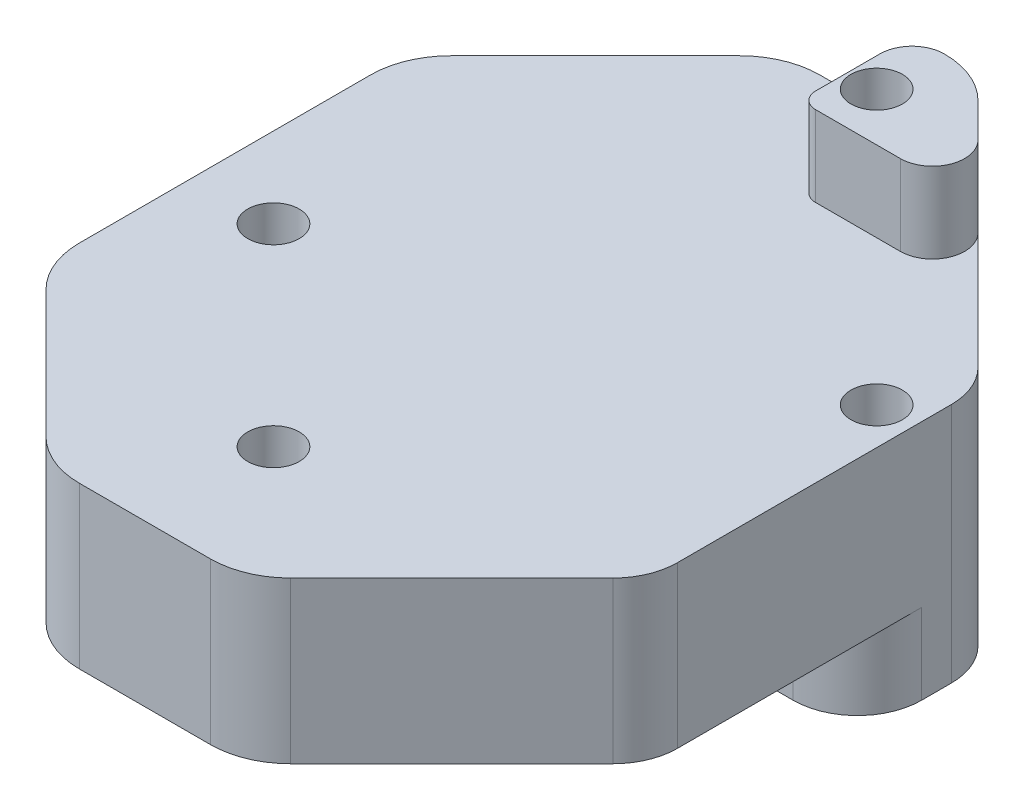
ISO-10303-21;
HEADER;
FILE_DESCRIPTION(('STEP AP214'),'2;1');
FILE_NAME('part.step','',(''),(''),'','','');
FILE_SCHEMA(('AUTOMOTIVE_DESIGN { 1 0 10303 214 1 1 1 1 }'));
ENDSEC;
DATA;
#1=APPLICATION_CONTEXT('core data for automotive mechanical design processes');
#2=APPLICATION_PROTOCOL_DEFINITION('international standard','automotive_design',2000,#1);
#3=PRODUCT_CONTEXT('',#1,'mechanical');
#4=PRODUCT('Part','Part','',(#3));
#5=PRODUCT_RELATED_PRODUCT_CATEGORY('part','',(#4));
#6=PRODUCT_DEFINITION_FORMATION('','',#4);
#7=PRODUCT_DEFINITION_CONTEXT('part definition',#1,'design');
#8=PRODUCT_DEFINITION('design','',#6,#7);
#9=PRODUCT_DEFINITION_SHAPE('','',#8);
#10=(LENGTH_UNIT() NAMED_UNIT(*) SI_UNIT(.MILLI.,.METRE.));
#11=(NAMED_UNIT(*) PLANE_ANGLE_UNIT() SI_UNIT($,.RADIAN.));
#12=(NAMED_UNIT(*) SI_UNIT($,.STERADIAN.) SOLID_ANGLE_UNIT());
#13=UNCERTAINTY_MEASURE_WITH_UNIT(LENGTH_MEASURE(1.E-05),#10,'distance_accuracy_value','');
#14=(GEOMETRIC_REPRESENTATION_CONTEXT(3) GLOBAL_UNCERTAINTY_ASSIGNED_CONTEXT((#13)) GLOBAL_UNIT_ASSIGNED_CONTEXT((#10,
#11,#12)) REPRESENTATION_CONTEXT('',''));
#15=CARTESIAN_POINT('',(0.,0.,0.));
#16=DIRECTION('',(0.,0.,1.));
#17=DIRECTION('',(1.,0.,0.));
#18=AXIS2_PLACEMENT_3D('',#15,#16,#17);
#19=CARTESIAN_POINT('',(0.,10.,0.));
#20=DIRECTION('',(0.,-1.,0.));
#21=DIRECTION('',(0.,0.,-1.));
#22=AXIS2_PLACEMENT_3D('',#19,#20,#21);
#23=PLANE('',#22);
#24=CARTESIAN_POINT('',(0.,10.,0.));
#25=DIRECTION('',(0.,1.,0.));
#26=DIRECTION('',(0.,0.,1.));
#27=AXIS2_PLACEMENT_3D('',#24,#25,#26);
#28=CIRCLE('',#27,1.6);
#29=CARTESIAN_POINT('',(0.,10.,1.6));
#30=VERTEX_POINT('',#29);
#31=EDGE_CURVE('E326',#30,#30,#28,.T.);
#32=ORIENTED_EDGE('',*,*,#31,.F.);
#33=EDGE_LOOP('',(#32));
#34=FACE_BOUND('',#33,.T.);
#35=CARTESIAN_POINT('',(-12.,10.,-12.));
#36=DIRECTION('',(0.,1.,0.));
#37=DIRECTION('',(0.,0.,1.));
#38=AXIS2_PLACEMENT_3D('',#35,#36,#37);
#39=CIRCLE('',#38,1.6);
#40=CARTESIAN_POINT('',(-12.,10.,-10.4));
#41=VERTEX_POINT('',#40);
#42=EDGE_CURVE('E320',#41,#41,#39,.T.);
#43=ORIENTED_EDGE('',*,*,#42,.F.);
#44=EDGE_LOOP('',(#43));
#45=FACE_BOUND('',#44,.T.);
#46=CARTESIAN_POINT('',(16.5,10.,-21.));
#47=DIRECTION('',(0.,1.,0.));
#48=DIRECTION('',(0.,0.,1.));
#49=AXIS2_PLACEMENT_3D('',#46,#47,#48);
#50=CIRCLE('',#49,1.60000000000001);
#51=CARTESIAN_POINT('',(16.5,10.,-19.4));
#52=VERTEX_POINT('',#51);
#53=EDGE_CURVE('E316',#52,#52,#50,.T.);
#54=ORIENTED_EDGE('',*,*,#53,.F.);
#55=EDGE_LOOP('',(#54));
#56=FACE_BOUND('',#55,.T.);
#57=DIRECTION('',(0.707106781186549,0.,-0.707106781186547));
#58=VECTOR('',#57,1.);
#59=CARTESIAN_POINT('',(6.14213562373095,10.,8.));
#60=LINE('',#59,#58);
#61=CARTESIAN_POINT('',(7.60660171779821,10.,6.53553390593274));
#62=VERTEX_POINT('',#61);
#63=CARTESIAN_POINT('',(17.6284271247462,10.,-3.4862915010152));
#64=VERTEX_POINT('',#63);
#65=EDGE_CURVE('E273',#62,#64,#60,.T.);
#66=ORIENTED_EDGE('',*,*,#65,.T.);
#67=CARTESIAN_POINT('',(14.8,10.,-6.3147186257614));
#68=DIRECTION('',(0.,-1.,0.));
#69=DIRECTION('',(0.,0.,-1.));
#70=AXIS2_PLACEMENT_3D('',#67,#68,#69);
#71=CIRCLE('',#70,4.);
#72=CARTESIAN_POINT('',(18.8,10.,-6.3147186257614));
#73=VERTEX_POINT('',#72);
#74=EDGE_CURVE('E448',#64,#73,#71,.F.);
#75=ORIENTED_EDGE('',*,*,#74,.T.);
#76=DIRECTION('',(0.,0.,1.));
#77=VECTOR('',#76,1.);
#78=CARTESIAN_POINT('',(18.8,10.,-25.));
#79=LINE('',#78,#77);
#80=CARTESIAN_POINT('',(18.8,10.,-23.3431457505076));
#81=VERTEX_POINT('',#80);
#82=EDGE_CURVE('E467',#81,#73,#79,.T.);
#83=ORIENTED_EDGE('',*,*,#82,.F.);
#84=CARTESIAN_POINT('',(14.8,10.,-23.3431457505076));
#85=DIRECTION('',(0.,-1.,0.));
#86=DIRECTION('',(0.,0.,-1.));
#87=AXIS2_PLACEMENT_3D('',#84,#85,#86);
#88=CIRCLE('',#87,4.);
#89=CARTESIAN_POINT('',(17.6284271247462,10.,-26.1715728752538));
#90=VERTEX_POINT('',#89);
#91=EDGE_CURVE('E50',#81,#90,#88,.F.);
#92=ORIENTED_EDGE('',*,*,#91,.T.);
#93=DIRECTION('',(-0.707106781186548,0.,-0.707106781186548));
#94=VECTOR('',#93,1.);
#95=CARTESIAN_POINT('',(6.79999999999999,10.,-37.));
#96=LINE('',#95,#94);
#97=CARTESIAN_POINT('',(10.3857864376269,10.,-33.4142135623731));
#98=VERTEX_POINT('',#97);
#99=EDGE_CURVE('E341',#90,#98,#96,.T.);
#100=ORIENTED_EDGE('',*,*,#99,.T.);
#101=CARTESIAN_POINT('',(8.9715728752538,10.,-32.));
#102=DIRECTION('',(0.,-1.,0.));
#103=DIRECTION('',(0.,0.,-1.));
#104=AXIS2_PLACEMENT_3D('',#101,#102,#103);
#105=CIRCLE('',#104,2.);
#106=CARTESIAN_POINT('',(8.9715728752538,10.,-30.));
#107=VERTEX_POINT('',#106);
#108=EDGE_CURVE('E428',#98,#107,#105,.T.);
#109=ORIENTED_EDGE('',*,*,#108,.T.);
#110=DIRECTION('',(1.,0.,0.));
#111=VECTOR('',#110,1.);
#112=CARTESIAN_POINT('',(3.7,10.,-30.));
#113=LINE('',#112,#111);
#114=CARTESIAN_POINT('',(3.7,10.,-30.));
#115=VERTEX_POINT('',#114);
#116=EDGE_CURVE('E264',#115,#107,#113,.T.);
#117=ORIENTED_EDGE('',*,*,#116,.F.);
#118=CARTESIAN_POINT('',(3.7,10.,-31.));
#119=DIRECTION('',(0.,1.,0.));
#120=DIRECTION('',(0.,0.,1.));
#121=AXIS2_PLACEMENT_3D('',#118,#119,#120);
#122=CIRCLE('',#121,1.);
#123=CARTESIAN_POINT('',(2.7,10.,-31.));
#124=VERTEX_POINT('',#123);
#125=EDGE_CURVE('E261',#124,#115,#122,.T.);
#126=ORIENTED_EDGE('',*,*,#125,.F.);
#127=DIRECTION('',(0.,0.,1.));
#128=VECTOR('',#127,1.);
#129=CARTESIAN_POINT('',(2.7,10.,-37.));
#130=LINE('',#129,#128);
#131=CARTESIAN_POINT('',(2.7,10.,-35.));
#132=VERTEX_POINT('',#131);
#133=EDGE_CURVE('E240',#132,#124,#130,.T.);
#134=ORIENTED_EDGE('',*,*,#133,.F.);
#135=CARTESIAN_POINT('',(4.7,10.,-35.));
#136=DIRECTION('',(0.,-1.,0.));
#137=DIRECTION('',(0.,0.,-1.));
#138=AXIS2_PLACEMENT_3D('',#135,#136,#137);
#139=CIRCLE('',#138,2.);
#140=CARTESIAN_POINT('',(4.69999999999999,10.,-37.));
#141=VERTEX_POINT('',#140);
#142=EDGE_CURVE('E425',#132,#141,#139,.T.);
#143=ORIENTED_EDGE('',*,*,#142,.T.);
#144=DIRECTION('',(-1.,0.,0.));
#145=VECTOR('',#144,1.);
#146=CARTESIAN_POINT('',(-17.,10.,-37.));
#147=LINE('',#146,#145);
#148=CARTESIAN_POINT('',(-3.02893218813453,10.,-37.));
#149=VERTEX_POINT('',#148);
#150=EDGE_CURVE('E332',#141,#149,#147,.T.);
#151=ORIENTED_EDGE('',*,*,#150,.T.);
#152=CARTESIAN_POINT('',(-3.02893218813452,10.,-32.));
#153=DIRECTION('',(0.,-1.,0.));
#154=DIRECTION('',(0.,0.,-1.));
#155=AXIS2_PLACEMENT_3D('',#152,#153,#154);
#156=CIRCLE('',#155,5.);
#157=CARTESIAN_POINT('',(-6.56446609406727,10.,-35.5355339059327));
#158=VERTEX_POINT('',#157);
#159=EDGE_CURVE('E353',#149,#158,#156,.F.);
#160=ORIENTED_EDGE('',*,*,#159,.T.);
#161=DIRECTION('',(-0.707106781186546,0.,0.707106781186549));
#162=VECTOR('',#161,1.);
#163=CARTESIAN_POINT('',(-5.10000000000001,10.,-37.));
#164=LINE('',#163,#162);
#165=CARTESIAN_POINT('',(-15.5355339059327,10.,-26.5644660940672));
#166=VERTEX_POINT('',#165);
#167=EDGE_CURVE('E244',#158,#166,#164,.T.);
#168=ORIENTED_EDGE('',*,*,#167,.T.);
#169=CARTESIAN_POINT('',(-12.,10.,-23.0289321881345));
#170=DIRECTION('',(0.,-1.,0.));
#171=DIRECTION('',(0.,0.,-1.));
#172=AXIS2_PLACEMENT_3D('',#169,#170,#171);
#173=CIRCLE('',#172,5.);
#174=CARTESIAN_POINT('',(-17.,10.,-23.0289321881345));
#175=VERTEX_POINT('',#174);
#176=EDGE_CURVE('E355',#166,#175,#173,.F.);
#177=ORIENTED_EDGE('',*,*,#176,.T.);
#178=DIRECTION('',(0.,0.,1.));
#179=VECTOR('',#178,1.);
#180=CARTESIAN_POINT('',(-17.,10.,8.));
#181=LINE('',#180,#179);
#182=CARTESIAN_POINT('',(-17.,10.,-4.92893218813449));
#183=VERTEX_POINT('',#182);
#184=EDGE_CURVE('E334',#175,#183,#181,.T.);
#185=ORIENTED_EDGE('',*,*,#184,.T.);
#186=CARTESIAN_POINT('',(-12.,10.,-4.92893218813449));
#187=DIRECTION('',(0.,-1.,0.));
#188=DIRECTION('',(0.,0.,-1.));
#189=AXIS2_PLACEMENT_3D('',#186,#187,#188);
#190=CIRCLE('',#189,5.);
#191=CARTESIAN_POINT('',(-15.5355339059327,10.,-1.39339828220175));
#192=VERTEX_POINT('',#191);
#193=EDGE_CURVE('E357',#183,#192,#190,.F.);
#194=ORIENTED_EDGE('',*,*,#193,.T.);
#195=DIRECTION('',(0.707106781186549,0.,0.707106781186546));
#196=VECTOR('',#195,1.);
#197=CARTESIAN_POINT('',(-17.,10.,-2.85786437626901));
#198=LINE('',#197,#196);
#199=CARTESIAN_POINT('',(-7.60660171779822,10.,6.53553390593274));
#200=VERTEX_POINT('',#199);
#201=EDGE_CURVE('E270',#192,#200,#198,.T.);
#202=ORIENTED_EDGE('',*,*,#201,.T.);
#203=CARTESIAN_POINT('',(-4.07106781186549,10.,3.));
#204=DIRECTION('',(0.,-1.,0.));
#205=DIRECTION('',(0.,0.,-1.));
#206=AXIS2_PLACEMENT_3D('',#203,#204,#205);
#207=CIRCLE('',#206,5.);
#208=CARTESIAN_POINT('',(-4.07106781186549,10.,8.));
#209=VERTEX_POINT('',#208);
#210=EDGE_CURVE('E359',#200,#209,#207,.F.);
#211=ORIENTED_EDGE('',*,*,#210,.T.);
#212=DIRECTION('',(1.,0.,0.));
#213=VECTOR('',#212,1.);
#214=CARTESIAN_POINT('',(21.8,10.,8.));
#215=LINE('',#214,#213);
#216=CARTESIAN_POINT('',(4.07106781186548,10.,8.));
#217=VERTEX_POINT('',#216);
#218=EDGE_CURVE('E338',#209,#217,#215,.T.);
#219=ORIENTED_EDGE('',*,*,#218,.T.);
#220=CARTESIAN_POINT('',(4.07106781186548,10.,3.));
#221=DIRECTION('',(0.,-1.,0.));
#222=DIRECTION('',(0.,0.,-1.));
#223=AXIS2_PLACEMENT_3D('',#220,#221,#222);
#224=CIRCLE('',#223,5.);
#225=EDGE_CURVE('E361',#217,#62,#224,.F.);
#226=ORIENTED_EDGE('',*,*,#225,.T.);
#227=EDGE_LOOP('',(#66,#75,#83,#92,#100,#109,#117,#126,#134,#143,#151,#160,#168,#177,#185,#194,
#202,#211,#219,#226));
#228=FACE_BOUND('',#227,.T.);
#229=ADVANCED_FACE('F35',(#34,#45,#56,#228),#23,.F.);
#230=CARTESIAN_POINT('',(0.,0.,0.));
#231=DIRECTION('',(0.,-1.,0.));
#232=DIRECTION('',(0.,0.,-1.));
#233=AXIS2_PLACEMENT_3D('',#230,#231,#232);
#234=PLANE('',#233);
#235=DIRECTION('',(0.,0.,-1.));
#236=VECTOR('',#235,1.);
#237=CARTESIAN_POINT('',(18.8,0.,0.));
#238=LINE('',#237,#236);
#239=CARTESIAN_POINT('',(18.8,0.,-6.3147186257614));
#240=VERTEX_POINT('',#239);
#241=CARTESIAN_POINT('',(18.8,0.,-21.5));
#242=VERTEX_POINT('',#241);
#243=EDGE_CURVE('E471',#240,#242,#238,.T.);
#244=ORIENTED_EDGE('',*,*,#243,.F.);
#245=CARTESIAN_POINT('',(14.8,0.,-6.3147186257614));
#246=DIRECTION('',(0.,-1.,0.));
#247=DIRECTION('',(0.,0.,-1.));
#248=AXIS2_PLACEMENT_3D('',#245,#246,#247);
#249=CIRCLE('',#248,4.);
#250=CARTESIAN_POINT('',(17.6284271247462,0.,-3.4862915010152));
#251=VERTEX_POINT('',#250);
#252=EDGE_CURVE('E58',#240,#251,#249,.T.);
#253=ORIENTED_EDGE('',*,*,#252,.T.);
#254=DIRECTION('',(-0.707106781186549,0.,0.707106781186547));
#255=VECTOR('',#254,1.);
#256=CARTESIAN_POINT('',(7.07106781186547,0.,7.07106781186549));
#257=LINE('',#256,#255);
#258=CARTESIAN_POINT('',(7.60660171779822,0.,6.53553390593274));
#259=VERTEX_POINT('',#258);
#260=EDGE_CURVE('E276',#251,#259,#257,.T.);
#261=ORIENTED_EDGE('',*,*,#260,.T.);
#262=CARTESIAN_POINT('',(4.07106781186548,0.,3.));
#263=DIRECTION('',(0.,-1.,0.));
#264=DIRECTION('',(0.,0.,-1.));
#265=AXIS2_PLACEMENT_3D('',#262,#263,#264);
#266=CIRCLE('',#265,5.);
#267=CARTESIAN_POINT('',(4.07106781186548,0.,8.));
#268=VERTEX_POINT('',#267);
#269=EDGE_CURVE('E371',#259,#268,#266,.T.);
#270=ORIENTED_EDGE('',*,*,#269,.T.);
#271=DIRECTION('',(1.,0.,0.));
#272=VECTOR('',#271,1.);
#273=CARTESIAN_POINT('',(21.8,0.,8.));
#274=LINE('',#273,#272);
#275=CARTESIAN_POINT('',(-4.07106781186549,0.,8.));
#276=VERTEX_POINT('',#275);
#277=EDGE_CURVE('E335',#276,#268,#274,.T.);
#278=ORIENTED_EDGE('',*,*,#277,.F.);
#279=CARTESIAN_POINT('',(-4.07106781186549,0.,3.));
#280=DIRECTION('',(0.,-1.,0.));
#281=DIRECTION('',(0.,0.,-1.));
#282=AXIS2_PLACEMENT_3D('',#279,#280,#281);
#283=CIRCLE('',#282,5.);
#284=CARTESIAN_POINT('',(-7.60660171779822,0.,6.53553390593274));
#285=VERTEX_POINT('',#284);
#286=EDGE_CURVE('E369',#276,#285,#283,.T.);
#287=ORIENTED_EDGE('',*,*,#286,.T.);
#288=DIRECTION('',(-0.707106781186549,0.,-0.707106781186546));
#289=VECTOR('',#288,1.);
#290=CARTESIAN_POINT('',(-7.07106781186547,0.,7.07106781186549));
#291=LINE('',#290,#289);
#292=CARTESIAN_POINT('',(-15.5355339059327,0.,-1.39339828220175));
#293=VERTEX_POINT('',#292);
#294=EDGE_CURVE('E278',#285,#293,#291,.T.);
#295=ORIENTED_EDGE('',*,*,#294,.T.);
#296=CARTESIAN_POINT('',(-12.,0.,-4.92893218813449));
#297=DIRECTION('',(0.,-1.,0.));
#298=DIRECTION('',(0.,0.,-1.));
#299=AXIS2_PLACEMENT_3D('',#296,#297,#298);
#300=CIRCLE('',#299,5.);
#301=CARTESIAN_POINT('',(-17.,0.,-4.92893218813449));
#302=VERTEX_POINT('',#301);
#303=EDGE_CURVE('E367',#293,#302,#300,.T.);
#304=ORIENTED_EDGE('',*,*,#303,.T.);
#305=DIRECTION('',(0.,0.,1.));
#306=VECTOR('',#305,1.);
#307=CARTESIAN_POINT('',(-17.,0.,8.));
#308=LINE('',#307,#306);
#309=CARTESIAN_POINT('',(-17.,0.,-23.0289321881345));
#310=VERTEX_POINT('',#309);
#311=EDGE_CURVE('E346',#310,#302,#308,.T.);
#312=ORIENTED_EDGE('',*,*,#311,.F.);
#313=CARTESIAN_POINT('',(-12.,0.,-23.0289321881345));
#314=DIRECTION('',(0.,-1.,0.));
#315=DIRECTION('',(0.,0.,-1.));
#316=AXIS2_PLACEMENT_3D('',#313,#314,#315);
#317=CIRCLE('',#316,5.);
#318=CARTESIAN_POINT('',(-15.5355339059327,0.,-26.5644660940672));
#319=VERTEX_POINT('',#318);
#320=EDGE_CURVE('E365',#310,#319,#317,.T.);
#321=ORIENTED_EDGE('',*,*,#320,.T.);
#322=DIRECTION('',(0.707106781186546,0.,-0.707106781186549));
#323=VECTOR('',#322,1.);
#324=CARTESIAN_POINT('',(-21.05,0.,-21.0499999999999));
#325=LINE('',#324,#323);
#326=CARTESIAN_POINT('',(-6.56446609406727,0.,-35.5355339059327));
#327=VERTEX_POINT('',#326);
#328=EDGE_CURVE('E281',#319,#327,#325,.T.);
#329=ORIENTED_EDGE('',*,*,#328,.T.);
#330=CARTESIAN_POINT('',(-3.02893218813452,0.,-32.));
#331=DIRECTION('',(0.,-1.,0.));
#332=DIRECTION('',(0.,0.,-1.));
#333=AXIS2_PLACEMENT_3D('',#330,#331,#332);
#334=CIRCLE('',#333,5.);
#335=CARTESIAN_POINT('',(-3.02893218813453,0.,-37.));
#336=VERTEX_POINT('',#335);
#337=EDGE_CURVE('E363',#327,#336,#334,.T.);
#338=ORIENTED_EDGE('',*,*,#337,.T.);
#339=DIRECTION('',(-1.,0.,0.));
#340=VECTOR('',#339,1.);
#341=CARTESIAN_POINT('',(-17.,0.,-37.));
#342=LINE('',#341,#340);
#343=CARTESIAN_POINT('',(2.,0.,-37.));
#344=VERTEX_POINT('',#343);
#345=EDGE_CURVE('E329',#344,#336,#342,.T.);
#346=ORIENTED_EDGE('',*,*,#345,.F.);
#347=CARTESIAN_POINT('',(2.,0.,-35.));
#348=DIRECTION('',(0.,-1.,0.));
#349=DIRECTION('',(0.,0.,-1.));
#350=AXIS2_PLACEMENT_3D('',#347,#348,#349);
#351=CIRCLE('',#350,2.);
#352=CARTESIAN_POINT('',(0.,0.,-35.));
#353=VERTEX_POINT('',#352);
#354=EDGE_CURVE('E411',#344,#353,#351,.F.);
#355=ORIENTED_EDGE('',*,*,#354,.T.);
#356=DIRECTION('',(0.,0.,-1.));
#357=VECTOR('',#356,1.);
#358=CARTESIAN_POINT('',(0.,0.,-19.5));
#359=LINE('',#358,#357);
#360=CARTESIAN_POINT('',(0.,0.,-19.5));
#361=VERTEX_POINT('',#360);
#362=EDGE_CURVE('E294',#361,#353,#359,.T.);
#363=ORIENTED_EDGE('',*,*,#362,.F.);
#364=CARTESIAN_POINT('',(2.,0.,-19.5));
#365=DIRECTION('',(0.,-1.,0.));
#366=DIRECTION('',(0.,0.,-1.));
#367=AXIS2_PLACEMENT_3D('',#364,#365,#366);
#368=CIRCLE('',#367,2.);
#369=CARTESIAN_POINT('',(2.,0.,-17.5));
#370=VERTEX_POINT('',#369);
#371=EDGE_CURVE('E306',#370,#361,#368,.T.);
#372=ORIENTED_EDGE('',*,*,#371,.F.);
#373=DIRECTION('',(-1.,0.,0.));
#374=VECTOR('',#373,1.);
#375=CARTESIAN_POINT('',(21.8,0.,-17.5));
#376=LINE('',#375,#374);
#377=CARTESIAN_POINT('',(14.8,0.,-17.5));
#378=VERTEX_POINT('',#377);
#379=EDGE_CURVE('E290',#378,#370,#376,.T.);
#380=ORIENTED_EDGE('',*,*,#379,.F.);
#381=CARTESIAN_POINT('',(14.8,0.,-21.5));
#382=DIRECTION('',(0.,-1.,0.));
#383=DIRECTION('',(0.,0.,-1.));
#384=AXIS2_PLACEMENT_3D('',#381,#382,#383);
#385=CIRCLE('',#384,4.);
#386=EDGE_CURVE('E12',#378,#242,#385,.F.);
#387=ORIENTED_EDGE('',*,*,#386,.T.);
#388=EDGE_LOOP('',(#244,#253,#261,#270,#278,#287,#295,#304,#312,#321,#329,#338,#346,#355,#363,
#372,#380,#387));
#389=FACE_BOUND('',#388,.T.);
#390=CARTESIAN_POINT('',(0.,0.,0.));
#391=DIRECTION('',(0.,1.,0.));
#392=DIRECTION('',(0.,0.,1.));
#393=AXIS2_PLACEMENT_3D('',#390,#391,#392);
#394=CIRCLE('',#393,1.6);
#395=CARTESIAN_POINT('',(0.,0.,1.6));
#396=VERTEX_POINT('',#395);
#397=EDGE_CURVE('E323',#396,#396,#394,.T.);
#398=ORIENTED_EDGE('',*,*,#397,.T.);
#399=EDGE_LOOP('',(#398));
#400=FACE_BOUND('',#399,.T.);
#401=CARTESIAN_POINT('',(-12.,0.,-12.));
#402=DIRECTION('',(0.,1.,0.));
#403=DIRECTION('',(0.,0.,1.));
#404=AXIS2_PLACEMENT_3D('',#401,#402,#403);
#405=CIRCLE('',#404,1.6);
#406=CARTESIAN_POINT('',(-12.,0.,-10.4));
#407=VERTEX_POINT('',#406);
#408=EDGE_CURVE('E319',#407,#407,#405,.T.);
#409=ORIENTED_EDGE('',*,*,#408,.T.);
#410=EDGE_LOOP('',(#409));
#411=FACE_BOUND('',#410,.T.);
#412=ADVANCED_FACE('F501',(#389,#400,#411),#234,.T.);
#413=CARTESIAN_POINT('',(-17.,10.,-37.));
#414=DIRECTION('',(0.,0.,1.));
#415=DIRECTION('',(1.,0.,0.));
#416=AXIS2_PLACEMENT_3D('',#413,#414,#415);
#417=PLANE('',#416);
#418=ORIENTED_EDGE('',*,*,#150,.F.);
#419=DIRECTION('',(0.,-1.,0.));
#420=VECTOR('',#419,1.);
#421=CARTESIAN_POINT('',(4.7,10.,-37.));
#422=LINE('',#421,#420);
#423=CARTESIAN_POINT('',(4.69999999999999,15.,-37.));
#424=VERTEX_POINT('',#423);
#425=EDGE_CURVE('E415',#141,#424,#422,.F.);
#426=ORIENTED_EDGE('',*,*,#425,.T.);
#427=DIRECTION('',(-1.,0.,0.));
#428=VECTOR('',#427,1.);
#429=CARTESIAN_POINT('',(4.72893218813451,15.,-37.));
#430=LINE('',#429,#428);
#431=CARTESIAN_POINT('',(4.72893218813451,15.,-37.));
#432=VERTEX_POINT('',#431);
#433=EDGE_CURVE('E234',#432,#424,#430,.T.);
#434=ORIENTED_EDGE('',*,*,#433,.F.);
#435=DIRECTION('',(0.,-1.,0.));
#436=VECTOR('',#435,1.);
#437=CARTESIAN_POINT('',(4.72893218813451,10.,-37.));
#438=LINE('',#437,#436);
#439=CARTESIAN_POINT('',(4.72893218813451,-5.,-37.));
#440=VERTEX_POINT('',#439);
#441=EDGE_CURVE('E393',#432,#440,#438,.T.);
#442=ORIENTED_EDGE('',*,*,#441,.T.);
#443=DIRECTION('',(1.,0.,0.));
#444=VECTOR('',#443,1.);
#445=CARTESIAN_POINT('',(0.,-5.,-37.));
#446=LINE('',#445,#444);
#447=CARTESIAN_POINT('',(2.,-5.,-37.));
#448=VERTEX_POINT('',#447);
#449=EDGE_CURVE('E299',#448,#440,#446,.T.);
#450=ORIENTED_EDGE('',*,*,#449,.F.);
#451=DIRECTION('',(0.,1.,0.));
#452=VECTOR('',#451,1.);
#453=CARTESIAN_POINT('',(2.,10.,-37.));
#454=LINE('',#453,#452);
#455=EDGE_CURVE('E404',#448,#344,#454,.T.);
#456=ORIENTED_EDGE('',*,*,#455,.T.);
#457=ORIENTED_EDGE('',*,*,#345,.T.);
#458=DIRECTION('',(0.,1.,0.));
#459=VECTOR('',#458,1.);
#460=CARTESIAN_POINT('',(-3.02893218813452,10.,-37.));
#461=LINE('',#460,#459);
#462=EDGE_CURVE('E396',#336,#149,#461,.T.);
#463=ORIENTED_EDGE('',*,*,#462,.T.);
#464=EDGE_LOOP('',(#418,#426,#434,#442,#450,#456,#457,#463));
#465=FACE_BOUND('',#464,.T.);
#466=ADVANCED_FACE('F494',(#465),#417,.F.);
#467=CARTESIAN_POINT('',(-17.,10.,8.));
#468=DIRECTION('',(1.,0.,0.));
#469=DIRECTION('',(0.,0.,-1.));
#470=AXIS2_PLACEMENT_3D('',#467,#468,#469);
#471=PLANE('',#470);
#472=ORIENTED_EDGE('',*,*,#311,.T.);
#473=DIRECTION('',(0.,1.,0.));
#474=VECTOR('',#473,1.);
#475=CARTESIAN_POINT('',(-17.,10.,-4.92893218813449));
#476=LINE('',#475,#474);
#477=EDGE_CURVE('E385',#302,#183,#476,.T.);
#478=ORIENTED_EDGE('',*,*,#477,.T.);
#479=ORIENTED_EDGE('',*,*,#184,.F.);
#480=DIRECTION('',(0.,1.,0.));
#481=VECTOR('',#480,1.);
#482=CARTESIAN_POINT('',(-17.,0.,-23.0289321881345));
#483=LINE('',#482,#481);
#484=EDGE_CURVE('E383',#175,#310,#483,.F.);
#485=ORIENTED_EDGE('',*,*,#484,.T.);
#486=EDGE_LOOP('',(#472,#478,#479,#485));
#487=FACE_BOUND('',#486,.T.);
#488=ADVANCED_FACE('F552',(#487),#471,.F.);
#489=CARTESIAN_POINT('',(21.8,10.,8.));
#490=DIRECTION('',(0.,0.,-1.));
#491=DIRECTION('',(-1.,0.,0.));
#492=AXIS2_PLACEMENT_3D('',#489,#490,#491);
#493=PLANE('',#492);
#494=ORIENTED_EDGE('',*,*,#277,.T.);
#495=DIRECTION('',(0.,1.,0.));
#496=VECTOR('',#495,1.);
#497=CARTESIAN_POINT('',(4.07106781186548,10.,8.));
#498=LINE('',#497,#496);
#499=EDGE_CURVE('E375',#268,#217,#498,.T.);
#500=ORIENTED_EDGE('',*,*,#499,.T.);
#501=ORIENTED_EDGE('',*,*,#218,.F.);
#502=DIRECTION('',(0.,1.,0.));
#503=VECTOR('',#502,1.);
#504=CARTESIAN_POINT('',(-4.07106781186548,0.,8.));
#505=LINE('',#504,#503);
#506=EDGE_CURVE('E373',#209,#276,#505,.F.);
#507=ORIENTED_EDGE('',*,*,#506,.T.);
#508=EDGE_LOOP('',(#494,#500,#501,#507));
#509=FACE_BOUND('',#508,.T.);
#510=ADVANCED_FACE('F534',(#509),#493,.F.);
#511=CARTESIAN_POINT('',(6.79999999999999,10.,-37.));
#512=DIRECTION('',(-0.707106781186548,0.,0.707106781186548));
#513=DIRECTION('',(0.707106781186548,0.,0.707106781186548));
#514=AXIS2_PLACEMENT_3D('',#511,#512,#513);
#515=PLANE('',#514);
#516=ORIENTED_EDGE('',*,*,#99,.F.);
#517=DIRECTION('',(0.,1.,0.));
#518=VECTOR('',#517,1.);
#519=CARTESIAN_POINT('',(17.6284271247462,10.,-26.1715728752538));
#520=LINE('',#519,#518);
#521=CARTESIAN_POINT('',(17.6284271247462,-5.,-26.1715728752538));
#522=VERTEX_POINT('',#521);
#523=EDGE_CURVE('E43',#90,#522,#520,.F.);
#524=ORIENTED_EDGE('',*,*,#523,.T.);
#525=DIRECTION('',(0.707106781186548,0.,0.707106781186548));
#526=VECTOR('',#525,1.);
#527=CARTESIAN_POINT('',(6.79999999999999,-5.,-37.));
#528=LINE('',#527,#526);
#529=CARTESIAN_POINT('',(8.26446609406725,-5.,-35.5355339059327));
#530=VERTEX_POINT('',#529);
#531=EDGE_CURVE('E301',#530,#522,#528,.T.);
#532=ORIENTED_EDGE('',*,*,#531,.F.);
#533=DIRECTION('',(0.,-1.,0.));
#534=VECTOR('',#533,1.);
#535=CARTESIAN_POINT('',(8.26446609406725,10.,-35.5355339059327));
#536=LINE('',#535,#534);
#537=CARTESIAN_POINT('',(8.26446609406725,15.,-35.5355339059327));
#538=VERTEX_POINT('',#537);
#539=EDGE_CURVE('E399',#530,#538,#536,.F.);
#540=ORIENTED_EDGE('',*,*,#539,.T.);
#541=DIRECTION('',(-0.707106781186548,0.,-0.707106781186547));
#542=VECTOR('',#541,1.);
#543=CARTESIAN_POINT('',(13.8,15.,-30.));
#544=LINE('',#543,#542);
#545=CARTESIAN_POINT('',(10.3857864376269,15.,-33.4142135623731));
#546=VERTEX_POINT('',#545);
#547=EDGE_CURVE('E252',#546,#538,#544,.T.);
#548=ORIENTED_EDGE('',*,*,#547,.F.);
#549=DIRECTION('',(0.,-1.,0.));
#550=VECTOR('',#549,1.);
#551=CARTESIAN_POINT('',(10.3857864376269,10.,-33.4142135623731));
#552=LINE('',#551,#550);
#553=EDGE_CURVE('E420',#546,#98,#552,.T.);
#554=ORIENTED_EDGE('',*,*,#553,.T.);
#555=EDGE_LOOP('',(#516,#524,#532,#540,#548,#554));
#556=FACE_BOUND('',#555,.T.);
#557=ADVANCED_FACE('F453',(#556),#515,.F.);
#558=CARTESIAN_POINT('',(0.,10.,0.));
#559=DIRECTION('',(0.,-1.,0.));
#560=DIRECTION('',(0.,0.,-1.));
#561=AXIS2_PLACEMENT_3D('',#558,#559,#560);
#562=CYLINDRICAL_SURFACE('',#561,1.6);
#563=ORIENTED_EDGE('',*,*,#31,.T.);
#564=EDGE_LOOP('',(#563));
#565=FACE_BOUND('',#564,.T.);
#566=ORIENTED_EDGE('',*,*,#397,.F.);
#567=EDGE_LOOP('',(#566));
#568=FACE_BOUND('',#567,.T.);
#569=ADVANCED_FACE('F587',(#565,#568),#562,.F.);
#570=CARTESIAN_POINT('',(-12.,10.,-12.));
#571=DIRECTION('',(0.,-1.,0.));
#572=DIRECTION('',(0.,0.,-1.));
#573=AXIS2_PLACEMENT_3D('',#570,#571,#572);
#574=CYLINDRICAL_SURFACE('',#573,1.6);
#575=ORIENTED_EDGE('',*,*,#42,.T.);
#576=EDGE_LOOP('',(#575));
#577=FACE_BOUND('',#576,.T.);
#578=ORIENTED_EDGE('',*,*,#408,.F.);
#579=EDGE_LOOP('',(#578));
#580=FACE_BOUND('',#579,.T.);
#581=ADVANCED_FACE('F649',(#577,#580),#574,.F.);
#582=CARTESIAN_POINT('',(4.5,10.,-33.));
#583=DIRECTION('',(0.,-1.,0.));
#584=DIRECTION('',(0.,0.,-1.));
#585=AXIS2_PLACEMENT_3D('',#582,#583,#584);
#586=CYLINDRICAL_SURFACE('',#585,1.60000000000001);
#587=CARTESIAN_POINT('',(4.5,-5.,-33.));
#588=DIRECTION('',(0.,-1.,0.));
#589=DIRECTION('',(0.,0.,-1.));
#590=AXIS2_PLACEMENT_3D('',#587,#588,#589);
#591=CIRCLE('',#590,1.60000000000001);
#592=CARTESIAN_POINT('',(4.5,-5.,-34.6));
#593=VERTEX_POINT('',#592);
#594=EDGE_CURVE('E287',#593,#593,#591,.T.);
#595=ORIENTED_EDGE('',*,*,#594,.T.);
#596=EDGE_LOOP('',(#595));
#597=FACE_BOUND('',#596,.T.);
#598=CARTESIAN_POINT('',(4.5,15.,-33.));
#599=DIRECTION('',(0.,1.,0.));
#600=DIRECTION('',(0.,0.,1.));
#601=AXIS2_PLACEMENT_3D('',#598,#599,#600);
#602=CIRCLE('',#601,1.60000000000001);
#603=CARTESIAN_POINT('',(4.5,15.,-31.4));
#604=VERTEX_POINT('',#603);
#605=EDGE_CURVE('E262',#604,#604,#602,.T.);
#606=ORIENTED_EDGE('',*,*,#605,.T.);
#607=EDGE_LOOP('',(#606));
#608=FACE_BOUND('',#607,.T.);
#609=ADVANCED_FACE('F643',(#597,#608),#586,.F.);
#610=CARTESIAN_POINT('',(16.5,10.,-21.));
#611=DIRECTION('',(0.,-1.,0.));
#612=DIRECTION('',(0.,0.,-1.));
#613=AXIS2_PLACEMENT_3D('',#610,#611,#612);
#614=CYLINDRICAL_SURFACE('',#613,1.60000000000001);
#615=ORIENTED_EDGE('',*,*,#53,.T.);
#616=EDGE_LOOP('',(#615));
#617=FACE_BOUND('',#616,.T.);
#618=CARTESIAN_POINT('',(16.5,-5.,-21.));
#619=DIRECTION('',(0.,-1.,0.));
#620=DIRECTION('',(0.,0.,-1.));
#621=AXIS2_PLACEMENT_3D('',#618,#619,#620);
#622=CIRCLE('',#621,1.60000000000001);
#623=CARTESIAN_POINT('',(16.5,-5.,-22.6));
#624=VERTEX_POINT('',#623);
#625=EDGE_CURVE('E284',#624,#624,#622,.T.);
#626=ORIENTED_EDGE('',*,*,#625,.T.);
#627=EDGE_LOOP('',(#626));
#628=FACE_BOUND('',#627,.T.);
#629=ADVANCED_FACE('F648',(#617,#628),#614,.F.);
#630=CARTESIAN_POINT('',(2.,-5.,-19.5));
#631=DIRECTION('',(0.,-1.,0.));
#632=DIRECTION('',(0.,0.,-1.));
#633=AXIS2_PLACEMENT_3D('',#630,#631,#632);
#634=PLANE('',#633);
#635=DIRECTION('',(0.,0.,-1.));
#636=VECTOR('',#635,1.);
#637=CARTESIAN_POINT('',(18.8,-5.,-19.5));
#638=LINE('',#637,#636);
#639=CARTESIAN_POINT('',(18.8,-5.,-21.5));
#640=VERTEX_POINT('',#639);
#641=CARTESIAN_POINT('',(18.8,-5.,-23.3431457505076));
#642=VERTEX_POINT('',#641);
#643=EDGE_CURVE('E469',#640,#642,#638,.T.);
#644=ORIENTED_EDGE('',*,*,#643,.F.);
#645=CARTESIAN_POINT('',(14.8,-5.,-21.5));
#646=DIRECTION('',(0.,-1.,0.));
#647=DIRECTION('',(0.,0.,-1.));
#648=AXIS2_PLACEMENT_3D('',#645,#646,#647);
#649=CIRCLE('',#648,4.);
#650=CARTESIAN_POINT('',(14.8,-5.,-17.5));
#651=VERTEX_POINT('',#650);
#652=EDGE_CURVE('E442',#640,#651,#649,.T.);
#653=ORIENTED_EDGE('',*,*,#652,.T.);
#654=DIRECTION('',(-1.,0.,0.));
#655=VECTOR('',#654,1.);
#656=CARTESIAN_POINT('',(21.8,-5.,-17.5));
#657=LINE('',#656,#655);
#658=CARTESIAN_POINT('',(2.,-5.,-17.5));
#659=VERTEX_POINT('',#658);
#660=EDGE_CURVE('E291',#651,#659,#657,.T.);
#661=ORIENTED_EDGE('',*,*,#660,.T.);
#662=CARTESIAN_POINT('',(2.,-5.,-19.5));
#663=DIRECTION('',(0.,-1.,0.));
#664=DIRECTION('',(0.,0.,-1.));
#665=AXIS2_PLACEMENT_3D('',#662,#663,#664);
#666=CIRCLE('',#665,2.);
#667=CARTESIAN_POINT('',(0.,-5.,-19.5));
#668=VERTEX_POINT('',#667);
#669=EDGE_CURVE('E293',#659,#668,#666,.T.);
#670=ORIENTED_EDGE('',*,*,#669,.T.);
#671=DIRECTION('',(0.,0.,-1.));
#672=VECTOR('',#671,1.);
#673=CARTESIAN_POINT('',(0.,-5.,-19.5));
#674=LINE('',#673,#672);
#675=CARTESIAN_POINT('',(0.,-5.,-35.));
#676=VERTEX_POINT('',#675);
#677=EDGE_CURVE('E296',#668,#676,#674,.T.);
#678=ORIENTED_EDGE('',*,*,#677,.T.);
#679=CARTESIAN_POINT('',(2.,-5.,-35.));
#680=DIRECTION('',(0.,-1.,0.));
#681=DIRECTION('',(0.,0.,-1.));
#682=AXIS2_PLACEMENT_3D('',#679,#680,#681);
#683=CIRCLE('',#682,2.);
#684=EDGE_CURVE('E409',#676,#448,#683,.T.);
#685=ORIENTED_EDGE('',*,*,#684,.T.);
#686=ORIENTED_EDGE('',*,*,#449,.T.);
#687=CARTESIAN_POINT('',(4.72893218813451,-5.,-32.));
#688=DIRECTION('',(0.,-1.,0.));
#689=DIRECTION('',(0.,0.,-1.));
#690=AXIS2_PLACEMENT_3D('',#687,#688,#689);
#691=CIRCLE('',#690,5.);
#692=EDGE_CURVE('E402',#440,#530,#691,.T.);
#693=ORIENTED_EDGE('',*,*,#692,.T.);
#694=ORIENTED_EDGE('',*,*,#531,.T.);
#695=CARTESIAN_POINT('',(14.8,-5.,-23.3431457505076));
#696=DIRECTION('',(0.,-1.,0.));
#697=DIRECTION('',(0.,0.,-1.));
#698=AXIS2_PLACEMENT_3D('',#695,#696,#697);
#699=CIRCLE('',#698,4.);
#700=EDGE_CURVE('E440',#522,#642,#699,.T.);
#701=ORIENTED_EDGE('',*,*,#700,.T.);
#702=EDGE_LOOP('',(#644,#653,#661,#670,#678,#685,#686,#693,#694,#701));
#703=FACE_BOUND('',#702,.T.);
#704=ORIENTED_EDGE('',*,*,#594,.F.);
#705=EDGE_LOOP('',(#704));
#706=FACE_BOUND('',#705,.T.);
#707=ORIENTED_EDGE('',*,*,#625,.F.);
#708=EDGE_LOOP('',(#707));
#709=FACE_BOUND('',#708,.T.);
#710=ADVANCED_FACE('F459',(#703,#706,#709),#634,.T.);
#711=CARTESIAN_POINT('',(21.8,-5.,-17.5));
#712=DIRECTION('',(0.,0.,-1.));
#713=DIRECTION('',(-1.,0.,0.));
#714=AXIS2_PLACEMENT_3D('',#711,#712,#713);
#715=PLANE('',#714);
#716=ORIENTED_EDGE('',*,*,#660,.F.);
#717=DIRECTION('',(0.,1.,0.));
#718=VECTOR('',#717,1.);
#719=CARTESIAN_POINT('',(14.8,-5.,-17.5));
#720=LINE('',#719,#718);
#721=EDGE_CURVE('E430',#651,#378,#720,.T.);
#722=ORIENTED_EDGE('',*,*,#721,.T.);
#723=ORIENTED_EDGE('',*,*,#379,.T.);
#724=DIRECTION('',(0.,1.,0.));
#725=VECTOR('',#724,1.);
#726=CARTESIAN_POINT('',(2.,-5.,-17.5));
#727=LINE('',#726,#725);
#728=EDGE_CURVE('E313',#659,#370,#727,.T.);
#729=ORIENTED_EDGE('',*,*,#728,.F.);
#730=EDGE_LOOP('',(#716,#722,#723,#729));
#731=FACE_BOUND('',#730,.T.);
#732=ADVANCED_FACE('F516',(#731),#715,.F.);
#733=CARTESIAN_POINT('',(2.,-5.,-19.5));
#734=DIRECTION('',(0.,1.,0.));
#735=DIRECTION('',(0.,0.,1.));
#736=AXIS2_PLACEMENT_3D('',#733,#734,#735);
#737=CYLINDRICAL_SURFACE('',#736,2.);
#738=ORIENTED_EDGE('',*,*,#371,.T.);
#739=DIRECTION('',(0.,1.,0.));
#740=VECTOR('',#739,1.);
#741=CARTESIAN_POINT('',(0.,-5.,-19.5));
#742=LINE('',#741,#740);
#743=EDGE_CURVE('E304',#668,#361,#742,.T.);
#744=ORIENTED_EDGE('',*,*,#743,.F.);
#745=ORIENTED_EDGE('',*,*,#669,.F.);
#746=ORIENTED_EDGE('',*,*,#728,.T.);
#747=EDGE_LOOP('',(#738,#744,#745,#746));
#748=FACE_BOUND('',#747,.T.);
#749=ADVANCED_FACE('F510',(#748),#737,.T.);
#750=CARTESIAN_POINT('',(0.,-5.,-19.5));
#751=DIRECTION('',(1.,0.,0.));
#752=DIRECTION('',(0.,0.,-1.));
#753=AXIS2_PLACEMENT_3D('',#750,#751,#752);
#754=PLANE('',#753);
#755=ORIENTED_EDGE('',*,*,#362,.T.);
#756=DIRECTION('',(0.,1.,0.));
#757=VECTOR('',#756,1.);
#758=CARTESIAN_POINT('',(0.,-5.,-35.));
#759=LINE('',#758,#757);
#760=EDGE_CURVE('E407',#353,#676,#759,.F.);
#761=ORIENTED_EDGE('',*,*,#760,.T.);
#762=ORIENTED_EDGE('',*,*,#677,.F.);
#763=ORIENTED_EDGE('',*,*,#743,.T.);
#764=EDGE_LOOP('',(#755,#761,#762,#763));
#765=FACE_BOUND('',#764,.T.);
#766=ADVANCED_FACE('F505',(#765),#754,.F.);
#767=CARTESIAN_POINT('',(6.14213562373095,-5.,8.));
#768=DIRECTION('',(0.707106781186546,0.,0.707106781186548));
#769=DIRECTION('',(0.707106781186549,0.,-0.707106781186547));
#770=AXIS2_PLACEMENT_3D('',#767,#768,#769);
#771=PLANE('',#770);
#772=ORIENTED_EDGE('',*,*,#260,.F.);
#773=DIRECTION('',(0.,1.,0.));
#774=VECTOR('',#773,1.);
#775=CARTESIAN_POINT('',(17.6284271247462,10.,-3.4862915010152));
#776=LINE('',#775,#774);
#777=EDGE_CURVE('E444',#251,#64,#776,.T.);
#778=ORIENTED_EDGE('',*,*,#777,.T.);
#779=ORIENTED_EDGE('',*,*,#65,.F.);
#780=DIRECTION('',(0.,1.,0.));
#781=VECTOR('',#780,1.);
#782=CARTESIAN_POINT('',(7.60660171779821,0.,6.53553390593274));
#783=LINE('',#782,#781);
#784=EDGE_CURVE('E343',#62,#259,#783,.F.);
#785=ORIENTED_EDGE('',*,*,#784,.T.);
#786=EDGE_LOOP('',(#772,#778,#779,#785));
#787=FACE_BOUND('',#786,.T.);
#788=ADVANCED_FACE('F526',(#787),#771,.T.);
#789=CARTESIAN_POINT('',(-17.,-5.,-2.85786437626901));
#790=DIRECTION('',(-0.707106781186546,0.,0.707106781186549));
#791=DIRECTION('',(0.707106781186549,0.,0.707106781186546));
#792=AXIS2_PLACEMENT_3D('',#789,#790,#791);
#793=PLANE('',#792);
#794=ORIENTED_EDGE('',*,*,#294,.F.);
#795=DIRECTION('',(0.,1.,0.));
#796=VECTOR('',#795,1.);
#797=CARTESIAN_POINT('',(-7.60660171779822,10.,6.53553390593274));
#798=LINE('',#797,#796);
#799=EDGE_CURVE('E380',#285,#200,#798,.T.);
#800=ORIENTED_EDGE('',*,*,#799,.T.);
#801=ORIENTED_EDGE('',*,*,#201,.F.);
#802=DIRECTION('',(0.,1.,0.));
#803=VECTOR('',#802,1.);
#804=CARTESIAN_POINT('',(-15.5355339059327,0.,-1.39339828220175));
#805=LINE('',#804,#803);
#806=EDGE_CURVE('E378',#192,#293,#805,.F.);
#807=ORIENTED_EDGE('',*,*,#806,.T.);
#808=EDGE_LOOP('',(#794,#800,#801,#807));
#809=FACE_BOUND('',#808,.T.);
#810=ADVANCED_FACE('F544',(#809),#793,.T.);
#811=CARTESIAN_POINT('',(-5.10000000000001,-5.,-37.));
#812=DIRECTION('',(-0.707106781186549,0.,-0.707106781186546));
#813=DIRECTION('',(-0.707106781186546,0.,0.707106781186549));
#814=AXIS2_PLACEMENT_3D('',#811,#812,#813);
#815=PLANE('',#814);
#816=ORIENTED_EDGE('',*,*,#328,.F.);
#817=DIRECTION('',(0.,1.,0.));
#818=VECTOR('',#817,1.);
#819=CARTESIAN_POINT('',(-15.5355339059327,10.,-26.5644660940672));
#820=LINE('',#819,#818);
#821=EDGE_CURVE('E390',#319,#166,#820,.T.);
#822=ORIENTED_EDGE('',*,*,#821,.T.);
#823=ORIENTED_EDGE('',*,*,#167,.F.);
#824=DIRECTION('',(0.,1.,0.));
#825=VECTOR('',#824,1.);
#826=CARTESIAN_POINT('',(-6.56446609406727,0.,-35.5355339059327));
#827=LINE('',#826,#825);
#828=EDGE_CURVE('E388',#158,#327,#827,.F.);
#829=ORIENTED_EDGE('',*,*,#828,.T.);
#830=EDGE_LOOP('',(#816,#822,#823,#829));
#831=FACE_BOUND('',#830,.T.);
#832=ADVANCED_FACE('F562',(#831),#815,.T.);
#833=CARTESIAN_POINT('',(4.07106781186548,10.,3.));
#834=DIRECTION('',(0.,-1.,0.));
#835=DIRECTION('',(0.,0.,-1.));
#836=AXIS2_PLACEMENT_3D('',#833,#834,#835);
#837=CYLINDRICAL_SURFACE('',#836,5.);
#838=ORIENTED_EDGE('',*,*,#269,.F.);
#839=ORIENTED_EDGE('',*,*,#784,.F.);
#840=ORIENTED_EDGE('',*,*,#225,.F.);
#841=ORIENTED_EDGE('',*,*,#499,.F.);
#842=EDGE_LOOP('',(#838,#839,#840,#841));
#843=FACE_BOUND('',#842,.T.);
#844=ADVANCED_FACE('F532',(#843),#837,.T.);
#845=CARTESIAN_POINT('',(-4.07106781186549,-5.,3.));
#846=DIRECTION('',(0.,-1.,0.));
#847=DIRECTION('',(0.,0.,-1.));
#848=AXIS2_PLACEMENT_3D('',#845,#846,#847);
#849=CYLINDRICAL_SURFACE('',#848,5.);
#850=ORIENTED_EDGE('',*,*,#286,.F.);
#851=ORIENTED_EDGE('',*,*,#506,.F.);
#852=ORIENTED_EDGE('',*,*,#210,.F.);
#853=ORIENTED_EDGE('',*,*,#799,.F.);
#854=EDGE_LOOP('',(#850,#851,#852,#853));
#855=FACE_BOUND('',#854,.T.);
#856=ADVANCED_FACE('F541',(#855),#849,.T.);
#857=CARTESIAN_POINT('',(-12.,10.,-4.92893218813449));
#858=DIRECTION('',(0.,-1.,0.));
#859=DIRECTION('',(0.,0.,-1.));
#860=AXIS2_PLACEMENT_3D('',#857,#858,#859);
#861=CYLINDRICAL_SURFACE('',#860,5.);
#862=ORIENTED_EDGE('',*,*,#303,.F.);
#863=ORIENTED_EDGE('',*,*,#806,.F.);
#864=ORIENTED_EDGE('',*,*,#193,.F.);
#865=ORIENTED_EDGE('',*,*,#477,.F.);
#866=EDGE_LOOP('',(#862,#863,#864,#865));
#867=FACE_BOUND('',#866,.T.);
#868=ADVANCED_FACE('F550',(#867),#861,.T.);
#869=CARTESIAN_POINT('',(-12.,-5.,-23.0289321881345));
#870=DIRECTION('',(0.,-1.,0.));
#871=DIRECTION('',(0.,0.,-1.));
#872=AXIS2_PLACEMENT_3D('',#869,#870,#871);
#873=CYLINDRICAL_SURFACE('',#872,5.);
#874=ORIENTED_EDGE('',*,*,#320,.F.);
#875=ORIENTED_EDGE('',*,*,#484,.F.);
#876=ORIENTED_EDGE('',*,*,#176,.F.);
#877=ORIENTED_EDGE('',*,*,#821,.F.);
#878=EDGE_LOOP('',(#874,#875,#876,#877));
#879=FACE_BOUND('',#878,.T.);
#880=ADVANCED_FACE('F559',(#879),#873,.T.);
#881=CARTESIAN_POINT('',(-3.02893218813452,10.,-32.));
#882=DIRECTION('',(0.,-1.,0.));
#883=DIRECTION('',(0.,0.,-1.));
#884=AXIS2_PLACEMENT_3D('',#881,#882,#883);
#885=CYLINDRICAL_SURFACE('',#884,5.);
#886=ORIENTED_EDGE('',*,*,#337,.F.);
#887=ORIENTED_EDGE('',*,*,#828,.F.);
#888=ORIENTED_EDGE('',*,*,#159,.F.);
#889=ORIENTED_EDGE('',*,*,#462,.F.);
#890=EDGE_LOOP('',(#886,#887,#888,#889));
#891=FACE_BOUND('',#890,.T.);
#892=ADVANCED_FACE('F568',(#891),#885,.T.);
#893=CARTESIAN_POINT('',(4.72893218813451,10.,-32.));
#894=DIRECTION('',(0.,-1.,0.));
#895=DIRECTION('',(0.,0.,-1.));
#896=AXIS2_PLACEMENT_3D('',#893,#894,#895);
#897=CYLINDRICAL_SURFACE('',#896,5.);
#898=ORIENTED_EDGE('',*,*,#441,.F.);
#899=CARTESIAN_POINT('',(4.72893218813452,15.,-32.));
#900=DIRECTION('',(0.,1.,0.));
#901=DIRECTION('',(0.,0.,1.));
#902=AXIS2_PLACEMENT_3D('',#899,#900,#901);
#903=CIRCLE('',#902,4.99999999999999);
#904=EDGE_CURVE('E257',#538,#432,#903,.T.);
#905=ORIENTED_EDGE('',*,*,#904,.F.);
#906=ORIENTED_EDGE('',*,*,#539,.F.);
#907=ORIENTED_EDGE('',*,*,#692,.F.);
#908=EDGE_LOOP('',(#898,#905,#906,#907));
#909=FACE_BOUND('',#908,.T.);
#910=ADVANCED_FACE('F492',(#909),#897,.T.);
#911=CARTESIAN_POINT('',(2.,10.,-35.));
#912=DIRECTION('',(0.,1.,0.));
#913=DIRECTION('',(0.,0.,1.));
#914=AXIS2_PLACEMENT_3D('',#911,#912,#913);
#915=CYLINDRICAL_SURFACE('',#914,2.);
#916=ORIENTED_EDGE('',*,*,#684,.F.);
#917=ORIENTED_EDGE('',*,*,#760,.F.);
#918=ORIENTED_EDGE('',*,*,#354,.F.);
#919=ORIENTED_EDGE('',*,*,#455,.F.);
#920=EDGE_LOOP('',(#916,#917,#918,#919));
#921=FACE_BOUND('',#920,.T.);
#922=ADVANCED_FACE('F499',(#921),#915,.T.);
#923=CARTESIAN_POINT('',(3.7,15.,-31.));
#924=DIRECTION('',(0.,1.,0.));
#925=DIRECTION('',(0.,0.,1.));
#926=AXIS2_PLACEMENT_3D('',#923,#924,#925);
#927=PLANE('',#926);
#928=ORIENTED_EDGE('',*,*,#433,.T.);
#929=CARTESIAN_POINT('',(4.7,15.,-35.));
#930=DIRECTION('',(0.,1.,0.));
#931=DIRECTION('',(0.,0.,1.));
#932=AXIS2_PLACEMENT_3D('',#929,#930,#931);
#933=CIRCLE('',#932,2.);
#934=CARTESIAN_POINT('',(2.7,15.,-35.));
#935=VERTEX_POINT('',#934);
#936=EDGE_CURVE('E230',#424,#935,#933,.T.);
#937=ORIENTED_EDGE('',*,*,#936,.T.);
#938=DIRECTION('',(0.,0.,1.));
#939=VECTOR('',#938,1.);
#940=CARTESIAN_POINT('',(2.7,15.,-37.));
#941=LINE('',#940,#939);
#942=CARTESIAN_POINT('',(2.7,15.,-31.));
#943=VERTEX_POINT('',#942);
#944=EDGE_CURVE('E220',#935,#943,#941,.T.);
#945=ORIENTED_EDGE('',*,*,#944,.T.);
#946=CARTESIAN_POINT('',(3.7,15.,-31.));
#947=DIRECTION('',(0.,1.,0.));
#948=DIRECTION('',(0.,0.,1.));
#949=AXIS2_PLACEMENT_3D('',#946,#947,#948);
#950=CIRCLE('',#949,1.);
#951=CARTESIAN_POINT('',(3.7,15.,-30.));
#952=VERTEX_POINT('',#951);
#953=EDGE_CURVE('E227',#943,#952,#950,.T.);
#954=ORIENTED_EDGE('',*,*,#953,.T.);
#955=DIRECTION('',(1.,0.,0.));
#956=VECTOR('',#955,1.);
#957=CARTESIAN_POINT('',(3.7,15.,-30.));
#958=LINE('',#957,#956);
#959=CARTESIAN_POINT('',(8.9715728752538,15.,-30.));
#960=VERTEX_POINT('',#959);
#961=EDGE_CURVE('E250',#952,#960,#958,.T.);
#962=ORIENTED_EDGE('',*,*,#961,.T.);
#963=CARTESIAN_POINT('',(8.9715728752538,15.,-32.));
#964=DIRECTION('',(0.,1.,0.));
#965=DIRECTION('',(0.,0.,1.));
#966=AXIS2_PLACEMENT_3D('',#963,#964,#965);
#967=CIRCLE('',#966,2.);
#968=EDGE_CURVE('E417',#960,#546,#967,.T.);
#969=ORIENTED_EDGE('',*,*,#968,.T.);
#970=ORIENTED_EDGE('',*,*,#547,.T.);
#971=ORIENTED_EDGE('',*,*,#904,.T.);
#972=EDGE_LOOP('',(#928,#937,#945,#954,#962,#969,#970,#971));
#973=FACE_BOUND('',#972,.T.);
#974=ORIENTED_EDGE('',*,*,#605,.F.);
#975=EDGE_LOOP('',(#974));
#976=FACE_BOUND('',#975,.T.);
#977=ADVANCED_FACE('F223',(#973,#976),#927,.T.);
#978=CARTESIAN_POINT('',(2.7,15.,-37.));
#979=DIRECTION('',(1.,0.,0.));
#980=DIRECTION('',(0.,0.,-1.));
#981=AXIS2_PLACEMENT_3D('',#978,#979,#980);
#982=PLANE('',#981);
#983=ORIENTED_EDGE('',*,*,#944,.F.);
#984=DIRECTION('',(0.,-1.,0.));
#985=VECTOR('',#984,1.);
#986=CARTESIAN_POINT('',(2.7,15.,-35.));
#987=LINE('',#986,#985);
#988=EDGE_CURVE('E413',#935,#132,#987,.T.);
#989=ORIENTED_EDGE('',*,*,#988,.T.);
#990=ORIENTED_EDGE('',*,*,#133,.T.);
#991=DIRECTION('',(0.,-1.,0.));
#992=VECTOR('',#991,1.);
#993=CARTESIAN_POINT('',(2.7,15.,-31.));
#994=LINE('',#993,#992);
#995=EDGE_CURVE('E237',#943,#124,#994,.T.);
#996=ORIENTED_EDGE('',*,*,#995,.F.);
#997=EDGE_LOOP('',(#983,#989,#990,#996));
#998=FACE_BOUND('',#997,.T.);
#999=ADVANCED_FACE('F238',(#998),#982,.F.);
#1000=CARTESIAN_POINT('',(3.7,15.,-31.));
#1001=DIRECTION('',(0.,-1.,0.));
#1002=DIRECTION('',(0.,0.,-1.));
#1003=AXIS2_PLACEMENT_3D('',#1000,#1001,#1002);
#1004=CYLINDRICAL_SURFACE('',#1003,1.);
#1005=ORIENTED_EDGE('',*,*,#125,.T.);
#1006=DIRECTION('',(0.,-1.,0.));
#1007=VECTOR('',#1006,1.);
#1008=CARTESIAN_POINT('',(3.7,15.,-30.));
#1009=LINE('',#1008,#1007);
#1010=EDGE_CURVE('E245',#952,#115,#1009,.T.);
#1011=ORIENTED_EDGE('',*,*,#1010,.F.);
#1012=ORIENTED_EDGE('',*,*,#953,.F.);
#1013=ORIENTED_EDGE('',*,*,#995,.T.);
#1014=EDGE_LOOP('',(#1005,#1011,#1012,#1013));
#1015=FACE_BOUND('',#1014,.T.);
#1016=ADVANCED_FACE('F247',(#1015),#1004,.T.);
#1017=CARTESIAN_POINT('',(3.7,15.,-30.));
#1018=DIRECTION('',(0.,0.,-1.));
#1019=DIRECTION('',(-1.,0.,0.));
#1020=AXIS2_PLACEMENT_3D('',#1017,#1018,#1019);
#1021=PLANE('',#1020);
#1022=ORIENTED_EDGE('',*,*,#116,.T.);
#1023=DIRECTION('',(0.,-1.,0.));
#1024=VECTOR('',#1023,1.);
#1025=CARTESIAN_POINT('',(8.9715728752538,15.,-30.));
#1026=LINE('',#1025,#1024);
#1027=EDGE_CURVE('E423',#107,#960,#1026,.F.);
#1028=ORIENTED_EDGE('',*,*,#1027,.T.);
#1029=ORIENTED_EDGE('',*,*,#961,.F.);
#1030=ORIENTED_EDGE('',*,*,#1010,.T.);
#1031=EDGE_LOOP('',(#1022,#1028,#1029,#1030));
#1032=FACE_BOUND('',#1031,.T.);
#1033=ADVANCED_FACE('F483',(#1032),#1021,.F.);
#1034=CARTESIAN_POINT('',(4.7,15.,-35.));
#1035=DIRECTION('',(0.,-1.,0.));
#1036=DIRECTION('',(0.,0.,-1.));
#1037=AXIS2_PLACEMENT_3D('',#1034,#1035,#1036);
#1038=CYLINDRICAL_SURFACE('',#1037,2.);
#1039=ORIENTED_EDGE('',*,*,#936,.F.);
#1040=ORIENTED_EDGE('',*,*,#425,.F.);
#1041=ORIENTED_EDGE('',*,*,#142,.F.);
#1042=ORIENTED_EDGE('',*,*,#988,.F.);
#1043=EDGE_LOOP('',(#1039,#1040,#1041,#1042));
#1044=FACE_BOUND('',#1043,.T.);
#1045=ADVANCED_FACE('F481',(#1044),#1038,.T.);
#1046=CARTESIAN_POINT('',(8.9715728752538,10.,-32.));
#1047=DIRECTION('',(0.,-1.,0.));
#1048=DIRECTION('',(0.,0.,-1.));
#1049=AXIS2_PLACEMENT_3D('',#1046,#1047,#1048);
#1050=CYLINDRICAL_SURFACE('',#1049,2.);
#1051=ORIENTED_EDGE('',*,*,#968,.F.);
#1052=ORIENTED_EDGE('',*,*,#1027,.F.);
#1053=ORIENTED_EDGE('',*,*,#108,.F.);
#1054=ORIENTED_EDGE('',*,*,#553,.F.);
#1055=EDGE_LOOP('',(#1051,#1052,#1053,#1054));
#1056=FACE_BOUND('',#1055,.T.);
#1057=ADVANCED_FACE('F489',(#1056),#1050,.T.);
#1058=CARTESIAN_POINT('',(18.8,-14.,-25.));
#1059=DIRECTION('',(-1.,0.,0.));
#1060=DIRECTION('',(0.,0.,1.));
#1061=AXIS2_PLACEMENT_3D('',#1058,#1059,#1060);
#1062=PLANE('',#1061);
#1063=ORIENTED_EDGE('',*,*,#243,.T.);
#1064=DIRECTION('',(0.,1.,0.));
#1065=VECTOR('',#1064,1.);
#1066=CARTESIAN_POINT('',(18.8,-14.,-21.5));
#1067=LINE('',#1066,#1065);
#1068=EDGE_CURVE('E438',#242,#640,#1067,.F.);
#1069=ORIENTED_EDGE('',*,*,#1068,.T.);
#1070=ORIENTED_EDGE('',*,*,#643,.T.);
#1071=DIRECTION('',(0.,1.,0.));
#1072=VECTOR('',#1071,1.);
#1073=CARTESIAN_POINT('',(18.8,-14.,-23.3431457505076));
#1074=LINE('',#1073,#1072);
#1075=EDGE_CURVE('E433',#642,#81,#1074,.T.);
#1076=ORIENTED_EDGE('',*,*,#1075,.T.);
#1077=ORIENTED_EDGE('',*,*,#82,.T.);
#1078=DIRECTION('',(0.,1.,0.));
#1079=VECTOR('',#1078,1.);
#1080=CARTESIAN_POINT('',(18.8,0.,-6.3147186257614));
#1081=LINE('',#1080,#1079);
#1082=EDGE_CURVE('E436',#73,#240,#1081,.F.);
#1083=ORIENTED_EDGE('',*,*,#1082,.T.);
#1084=EDGE_LOOP('',(#1063,#1069,#1070,#1076,#1077,#1083));
#1085=FACE_BOUND('',#1084,.T.);
#1086=ADVANCED_FACE('F466',(#1085),#1062,.F.);
#1087=CARTESIAN_POINT('',(14.8,-5.,-21.5));
#1088=DIRECTION('',(0.,1.,0.));
#1089=DIRECTION('',(0.,0.,1.));
#1090=AXIS2_PLACEMENT_3D('',#1087,#1088,#1089);
#1091=CYLINDRICAL_SURFACE('',#1090,4.);
#1092=ORIENTED_EDGE('',*,*,#652,.F.);
#1093=ORIENTED_EDGE('',*,*,#1068,.F.);
#1094=ORIENTED_EDGE('',*,*,#386,.F.);
#1095=ORIENTED_EDGE('',*,*,#721,.F.);
#1096=EDGE_LOOP('',(#1092,#1093,#1094,#1095));
#1097=FACE_BOUND('',#1096,.T.);
#1098=ADVANCED_FACE('F520',(#1097),#1091,.T.);
#1099=CARTESIAN_POINT('',(14.8,-5.,-6.3147186257614));
#1100=DIRECTION('',(0.,-1.,0.));
#1101=DIRECTION('',(0.,0.,-1.));
#1102=AXIS2_PLACEMENT_3D('',#1099,#1100,#1101);
#1103=CYLINDRICAL_SURFACE('',#1102,4.);
#1104=ORIENTED_EDGE('',*,*,#252,.F.);
#1105=ORIENTED_EDGE('',*,*,#1082,.F.);
#1106=ORIENTED_EDGE('',*,*,#74,.F.);
#1107=ORIENTED_EDGE('',*,*,#777,.F.);
#1108=EDGE_LOOP('',(#1104,#1105,#1106,#1107));
#1109=FACE_BOUND('',#1108,.T.);
#1110=ADVANCED_FACE('F523',(#1109),#1103,.T.);
#1111=CARTESIAN_POINT('',(14.8,-14.,-23.3431457505076));
#1112=DIRECTION('',(0.,1.,0.));
#1113=DIRECTION('',(0.,0.,1.));
#1114=AXIS2_PLACEMENT_3D('',#1111,#1112,#1113);
#1115=CYLINDRICAL_SURFACE('',#1114,4.);
#1116=ORIENTED_EDGE('',*,*,#700,.F.);
#1117=ORIENTED_EDGE('',*,*,#523,.F.);
#1118=ORIENTED_EDGE('',*,*,#91,.F.);
#1119=ORIENTED_EDGE('',*,*,#1075,.F.);
#1120=EDGE_LOOP('',(#1116,#1117,#1118,#1119));
#1121=FACE_BOUND('',#1120,.T.);
#1122=ADVANCED_FACE('F37',(#1121),#1115,.T.);
#1123=CLOSED_SHELL('',(#229,#412,#466,#488,#510,#557,#569,#581,#609,#629,#710,#732,#749,#766,
#788,#810,#832,#844,#856,#868,#880,#892,#910,#922,#977,#999,#1016,#1033,#1045,#1057,#1086,#1098,
#1110,#1122));
#1124=MANIFOLD_SOLID_BREP('B2',#1123);
#1125=ADVANCED_BREP_SHAPE_REPRESENTATION('',(#18,#1124),#14);
#1126=SHAPE_DEFINITION_REPRESENTATION(#9,#1125);
ENDSEC;
END-ISO-10303-21;
